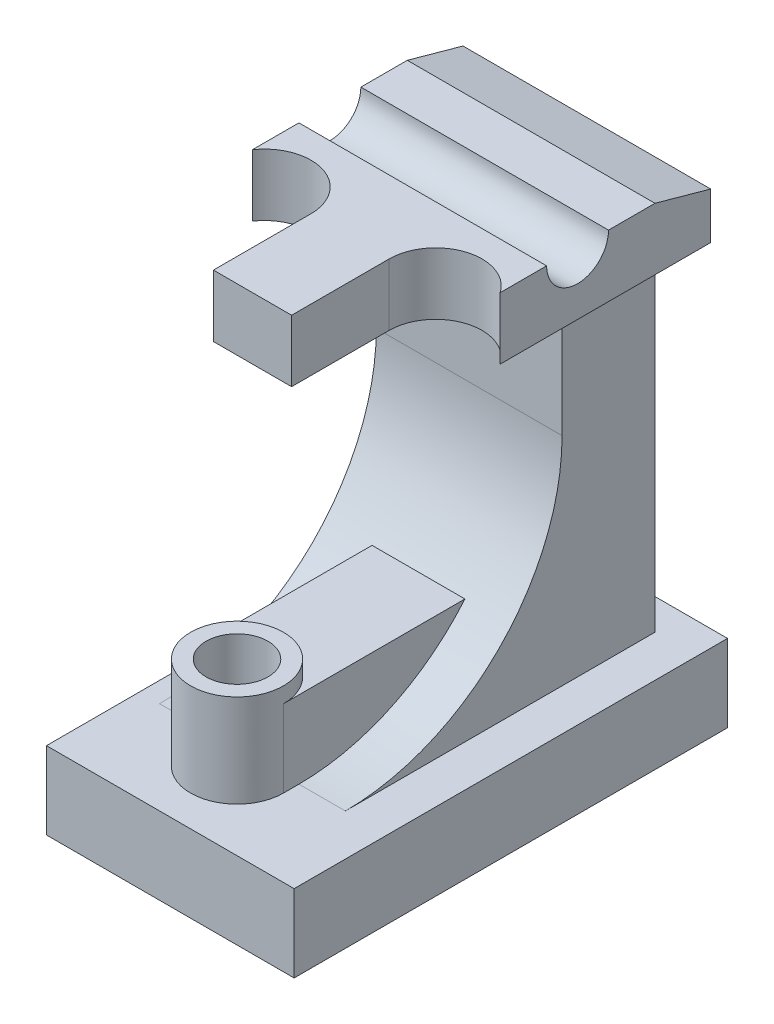
ISO-10303-21;
HEADER;
FILE_DESCRIPTION(('STEP AP214'),'2;1');
FILE_NAME('part.step','',(''),(''),'','','');
FILE_SCHEMA(('AUTOMOTIVE_DESIGN { 1 0 10303 214 1 1 1 1 }'));
ENDSEC;
DATA;
#1=APPLICATION_CONTEXT('core data for automotive mechanical design processes');
#2=APPLICATION_PROTOCOL_DEFINITION('international standard','automotive_design',2000,#1);
#3=PRODUCT_CONTEXT('',#1,'mechanical');
#4=PRODUCT('Part','Part','',(#3));
#5=PRODUCT_RELATED_PRODUCT_CATEGORY('part','',(#4));
#6=PRODUCT_DEFINITION_FORMATION('','',#4);
#7=PRODUCT_DEFINITION_CONTEXT('part definition',#1,'design');
#8=PRODUCT_DEFINITION('design','',#6,#7);
#9=PRODUCT_DEFINITION_SHAPE('','',#8);
#10=(LENGTH_UNIT() NAMED_UNIT(*) SI_UNIT(.MILLI.,.METRE.));
#11=(NAMED_UNIT(*) PLANE_ANGLE_UNIT() SI_UNIT($,.RADIAN.));
#12=(NAMED_UNIT(*) SI_UNIT($,.STERADIAN.) SOLID_ANGLE_UNIT());
#13=UNCERTAINTY_MEASURE_WITH_UNIT(LENGTH_MEASURE(1.E-05),#10,'distance_accuracy_value','');
#14=(GEOMETRIC_REPRESENTATION_CONTEXT(3) GLOBAL_UNCERTAINTY_ASSIGNED_CONTEXT((#13)) GLOBAL_UNIT_ASSIGNED_CONTEXT((#10,
#11,#12)) REPRESENTATION_CONTEXT('',''));
#15=CARTESIAN_POINT('',(0.,0.,0.));
#16=DIRECTION('',(0.,0.,1.));
#17=DIRECTION('',(1.,0.,0.));
#18=AXIS2_PLACEMENT_3D('',#15,#16,#17);
#19=CARTESIAN_POINT('',(-27.6290199979204,155.,36.5126923429088));
#20=DIRECTION('',(0.,-1.,0.));
#21=DIRECTION('',(0.,0.,-1.));
#22=AXIS2_PLACEMENT_3D('',#19,#20,#21);
#23=PLANE('',#22);
#24=DIRECTION('',(0.,0.,-1.));
#25=VECTOR('',#24,1.);
#26=CARTESIAN_POINT('',(40.,155.,28.0298358789489));
#27=LINE('',#26,#25);
#28=CARTESIAN_POINT('',(40.,155.,-6.97016412105114));
#29=VERTEX_POINT('',#28);
#30=CARTESIAN_POINT('',(40.,155.,-21.9701641210511));
#31=VERTEX_POINT('',#30);
#32=EDGE_CURVE('E368',#29,#31,#27,.T.);
#33=ORIENTED_EDGE('',*,*,#32,.T.);
#34=DIRECTION('',(1.,0.,0.));
#35=VECTOR('',#34,1.);
#36=CARTESIAN_POINT('',(-40.001,155.,-21.9701641210512));
#37=LINE('',#36,#35);
#38=CARTESIAN_POINT('',(-40.,155.,-21.9701641210512));
#39=VERTEX_POINT('',#38);
#40=EDGE_CURVE('E215',#39,#31,#37,.T.);
#41=ORIENTED_EDGE('',*,*,#40,.F.);
#42=DIRECTION('',(0.,0.,1.));
#43=VECTOR('',#42,1.);
#44=CARTESIAN_POINT('',(-40.,155.,28.0298358789489));
#45=LINE('',#44,#43);
#46=CARTESIAN_POINT('',(-40.,155.,-6.97016412105115));
#47=VERTEX_POINT('',#46);
#48=EDGE_CURVE('E223',#39,#47,#45,.T.);
#49=ORIENTED_EDGE('',*,*,#48,.T.);
#50=DIRECTION('',(1.,0.,0.));
#51=VECTOR('',#50,1.);
#52=CARTESIAN_POINT('',(-40.001,155.,-6.97016412105115));
#53=LINE('',#52,#51);
#54=EDGE_CURVE('E437',#47,#29,#53,.T.);
#55=ORIENTED_EDGE('',*,*,#54,.T.);
#56=EDGE_LOOP('',(#33,#41,#49,#55));
#57=FACE_BOUND('',#56,.T.);
#58=ADVANCED_FACE('F43',(#57),#23,.F.);
#59=CARTESIAN_POINT('',(0.,25.,0.));
#60=DIRECTION('',(0.,1.,0.));
#61=DIRECTION('',(0.,0.,1.));
#62=AXIS2_PLACEMENT_3D('',#59,#60,#61);
#63=PLANE('',#62);
#64=DIRECTION('',(0.,0.,1.));
#65=VECTOR('',#64,1.);
#66=CARTESIAN_POINT('',(-36.5539322644911,25.,-41.9701641210511));
#67=LINE('',#66,#65);
#68=CARTESIAN_POINT('',(-36.5539322644911,25.,-41.9701641210511));
#69=VERTEX_POINT('',#68);
#70=CARTESIAN_POINT('',(-36.5539322644911,25.,98.0298358789489));
#71=VERTEX_POINT('',#70);
#72=EDGE_CURVE('E741',#69,#71,#67,.T.);
#73=ORIENTED_EDGE('',*,*,#72,.T.);
#74=DIRECTION('',(1.,0.,0.));
#75=VECTOR('',#74,1.);
#76=CARTESIAN_POINT('',(-36.5539322644911,25.,98.0298358789489));
#77=LINE('',#76,#75);
#78=CARTESIAN_POINT('',(43.4460677355089,25.,98.0298358789489));
#79=VERTEX_POINT('',#78);
#80=EDGE_CURVE('E744',#71,#79,#77,.T.);
#81=ORIENTED_EDGE('',*,*,#80,.T.);
#82=DIRECTION('',(0.,0.,-1.));
#83=VECTOR('',#82,1.);
#84=CARTESIAN_POINT('',(43.4460677355089,25.,-41.9701641210511));
#85=LINE('',#84,#83);
#86=CARTESIAN_POINT('',(43.4460677355089,25.,-41.9701641210511));
#87=VERTEX_POINT('',#86);
#88=EDGE_CURVE('E747',#79,#87,#85,.T.);
#89=ORIENTED_EDGE('',*,*,#88,.T.);
#90=DIRECTION('',(-1.,0.,0.));
#91=VECTOR('',#90,1.);
#92=CARTESIAN_POINT('',(-36.5539322644911,25.,-41.9701641210511));
#93=LINE('',#92,#91);
#94=EDGE_CURVE('E749',#87,#69,#93,.T.);
#95=ORIENTED_EDGE('',*,*,#94,.T.);
#96=EDGE_LOOP('',(#73,#81,#89,#95));
#97=FACE_BOUND('',#96,.T.);
#98=DIRECTION('',(1.,0.,0.));
#99=VECTOR('',#98,1.);
#100=CARTESIAN_POINT('',(-30.,25.,68.0298358789489));
#101=LINE('',#100,#99);
#102=CARTESIAN_POINT('',(15.,25.,68.0298358789489));
#103=VERTEX_POINT('',#102);
#104=CARTESIAN_POINT('',(30.,25.,68.0298358789489));
#105=VERTEX_POINT('',#104);
#106=EDGE_CURVE('E723',#103,#105,#101,.T.);
#107=ORIENTED_EDGE('',*,*,#106,.F.);
#108=DIRECTION('',(0.,0.,1.));
#109=VECTOR('',#108,1.);
#110=CARTESIAN_POINT('',(15.,25.,0.));
#111=LINE('',#110,#109);
#112=CARTESIAN_POINT('',(15.,25.,73.0298358789489));
#113=VERTEX_POINT('',#112);
#114=EDGE_CURVE('E257',#103,#113,#111,.T.);
#115=ORIENTED_EDGE('',*,*,#114,.T.);
#116=CARTESIAN_POINT('',(0.,25.,73.0298358789489));
#117=DIRECTION('',(0.,1.,0.));
#118=DIRECTION('',(0.,0.,1.));
#119=AXIS2_PLACEMENT_3D('',#116,#117,#118);
#120=CIRCLE('',#119,15.);
#121=CARTESIAN_POINT('',(-15.,25.,73.0298358789489));
#122=VERTEX_POINT('',#121);
#123=EDGE_CURVE('E266',#113,#122,#120,.F.);
#124=ORIENTED_EDGE('',*,*,#123,.T.);
#125=DIRECTION('',(0.,0.,1.));
#126=VECTOR('',#125,1.);
#127=CARTESIAN_POINT('',(-15.,25.,0.));
#128=LINE('',#127,#126);
#129=CARTESIAN_POINT('',(-15.,25.,68.0298358789489));
#130=VERTEX_POINT('',#129);
#131=EDGE_CURVE('E252',#130,#122,#128,.T.);
#132=ORIENTED_EDGE('',*,*,#131,.F.);
#133=CARTESIAN_POINT('',(-30.,25.,68.0298358789489));
#134=VERTEX_POINT('',#133);
#135=EDGE_CURVE('E722',#134,#130,#101,.T.);
#136=ORIENTED_EDGE('',*,*,#135,.F.);
#137=DIRECTION('',(0.,0.,-1.));
#138=VECTOR('',#137,1.);
#139=CARTESIAN_POINT('',(-30.,25.,68.0298358789489));
#140=LINE('',#139,#138);
#141=CARTESIAN_POINT('',(-30.,25.,-31.9701641210511));
#142=VERTEX_POINT('',#141);
#143=EDGE_CURVE('E796',#134,#142,#140,.T.);
#144=ORIENTED_EDGE('',*,*,#143,.T.);
#145=DIRECTION('',(1.,0.,0.));
#146=VECTOR('',#145,1.);
#147=CARTESIAN_POINT('',(-30.,25.,-31.9701641210511));
#148=LINE('',#147,#146);
#149=CARTESIAN_POINT('',(30.,25.,-31.9701641210511));
#150=VERTEX_POINT('',#149);
#151=EDGE_CURVE('E738',#142,#150,#148,.T.);
#152=ORIENTED_EDGE('',*,*,#151,.T.);
#153=DIRECTION('',(0.,0.,-1.));
#154=VECTOR('',#153,1.);
#155=CARTESIAN_POINT('',(30.,25.,68.0298358789489));
#156=LINE('',#155,#154);
#157=EDGE_CURVE('E269',#105,#150,#156,.T.);
#158=ORIENTED_EDGE('',*,*,#157,.F.);
#159=EDGE_LOOP('',(#107,#115,#124,#132,#136,#144,#152,#158));
#160=FACE_BOUND('',#159,.T.);
#161=ADVANCED_FACE('F300',(#97,#160),#63,.T.);
#162=CARTESIAN_POINT('',(-30.,95.,68.0298358789489));
#163=DIRECTION('',(1.,0.,0.));
#164=DIRECTION('',(0.,0.,-1.));
#165=AXIS2_PLACEMENT_3D('',#162,#163,#164);
#166=CYLINDRICAL_SURFACE('',#165,70.);
#167=DIRECTION('',(1.,0.,0.));
#168=VECTOR('',#167,1.);
#169=CARTESIAN_POINT('',(-30.,50.,14.4108094051308));
#170=LINE('',#169,#168);
#171=CARTESIAN_POINT('',(15.,50.,14.4108094051308));
#172=VERTEX_POINT('',#171);
#173=CARTESIAN_POINT('',(-15.,50.,14.4108094051308));
#174=VERTEX_POINT('',#173);
#175=EDGE_CURVE('E246',#172,#174,#170,.F.);
#176=ORIENTED_EDGE('',*,*,#175,.F.);
#177=CARTESIAN_POINT('',(15.,95.,68.0298358789489));
#178=DIRECTION('',(-1.,0.,0.));
#179=DIRECTION('',(0.,0.,1.));
#180=AXIS2_PLACEMENT_3D('',#177,#178,#179);
#181=CIRCLE('',#180,70.);
#182=EDGE_CURVE('E255',#172,#103,#181,.T.);
#183=ORIENTED_EDGE('',*,*,#182,.T.);
#184=ORIENTED_EDGE('',*,*,#106,.T.);
#185=CARTESIAN_POINT('',(30.,95.,68.0298358789489));
#186=DIRECTION('',(-1.,0.,0.));
#187=DIRECTION('',(0.,0.,1.));
#188=AXIS2_PLACEMENT_3D('',#185,#186,#187);
#189=CIRCLE('',#188,70.);
#190=CARTESIAN_POINT('',(30.,95.,-1.97016412105114));
#191=VERTEX_POINT('',#190);
#192=EDGE_CURVE('E794',#191,#105,#189,.T.);
#193=ORIENTED_EDGE('',*,*,#192,.F.);
#194=DIRECTION('',(1.,0.,0.));
#195=VECTOR('',#194,1.);
#196=CARTESIAN_POINT('',(-30.,95.,-1.97016412105114));
#197=LINE('',#196,#195);
#198=CARTESIAN_POINT('',(-30.,95.,-1.97016412105114));
#199=VERTEX_POINT('',#198);
#200=EDGE_CURVE('E727',#199,#191,#197,.T.);
#201=ORIENTED_EDGE('',*,*,#200,.F.);
#202=CARTESIAN_POINT('',(-30.,95.,68.0298358789489));
#203=DIRECTION('',(-1.,0.,0.));
#204=DIRECTION('',(0.,0.,1.));
#205=AXIS2_PLACEMENT_3D('',#202,#203,#204);
#206=CIRCLE('',#205,70.);
#207=EDGE_CURVE('E730',#199,#134,#206,.T.);
#208=ORIENTED_EDGE('',*,*,#207,.T.);
#209=ORIENTED_EDGE('',*,*,#135,.T.);
#210=CARTESIAN_POINT('',(-15.,95.,68.0298358789489));
#211=DIRECTION('',(-1.,0.,0.));
#212=DIRECTION('',(0.,0.,1.));
#213=AXIS2_PLACEMENT_3D('',#210,#211,#212);
#214=CIRCLE('',#213,70.);
#215=EDGE_CURVE('E249',#174,#130,#214,.T.);
#216=ORIENTED_EDGE('',*,*,#215,.F.);
#217=EDGE_LOOP('',(#176,#183,#184,#193,#201,#208,#209,#216));
#218=FACE_BOUND('',#217,.T.);
#219=ADVANCED_FACE('F297',(#218),#166,.F.);
#220=CARTESIAN_POINT('',(-36.5539322644911,25.,-41.9701641210511));
#221=DIRECTION('',(1.,0.,0.));
#222=DIRECTION('',(0.,0.,-1.));
#223=AXIS2_PLACEMENT_3D('',#220,#221,#222);
#224=PLANE('',#223);
#225=DIRECTION('',(0.,0.,1.));
#226=VECTOR('',#225,1.);
#227=CARTESIAN_POINT('',(-36.5539322644911,0.,-41.9701641210511));
#228=LINE('',#227,#226);
#229=CARTESIAN_POINT('',(-36.5539322644911,0.,-41.9701641210511));
#230=VERTEX_POINT('',#229);
#231=CARTESIAN_POINT('',(-36.5539322644911,0.,98.0298358789489));
#232=VERTEX_POINT('',#231);
#233=EDGE_CURVE('E726',#230,#232,#228,.T.);
#234=ORIENTED_EDGE('',*,*,#233,.T.);
#235=DIRECTION('',(0.,-1.,0.));
#236=VECTOR('',#235,1.);
#237=CARTESIAN_POINT('',(-36.5539322644911,25.,98.0298358789489));
#238=LINE('',#237,#236);
#239=EDGE_CURVE('E767',#71,#232,#238,.T.);
#240=ORIENTED_EDGE('',*,*,#239,.F.);
#241=ORIENTED_EDGE('',*,*,#72,.F.);
#242=DIRECTION('',(0.,-1.,0.));
#243=VECTOR('',#242,1.);
#244=CARTESIAN_POINT('',(-36.5539322644911,25.,-41.9701641210511));
#245=LINE('',#244,#243);
#246=EDGE_CURVE('E751',#69,#230,#245,.T.);
#247=ORIENTED_EDGE('',*,*,#246,.T.);
#248=EDGE_LOOP('',(#234,#240,#241,#247));
#249=FACE_BOUND('',#248,.T.);
#250=ADVANCED_FACE('F45',(#249),#224,.F.);
#251=CARTESIAN_POINT('',(-36.5539322644911,25.,98.0298358789489));
#252=DIRECTION('',(0.,0.,-1.));
#253=DIRECTION('',(-1.,0.,0.));
#254=AXIS2_PLACEMENT_3D('',#251,#252,#253);
#255=PLANE('',#254);
#256=DIRECTION('',(1.,0.,0.));
#257=VECTOR('',#256,1.);
#258=CARTESIAN_POINT('',(-36.5539322644911,0.,98.0298358789489));
#259=LINE('',#258,#257);
#260=CARTESIAN_POINT('',(43.4460677355089,0.,98.0298358789489));
#261=VERTEX_POINT('',#260);
#262=EDGE_CURVE('E754',#232,#261,#259,.T.);
#263=ORIENTED_EDGE('',*,*,#262,.T.);
#264=DIRECTION('',(0.,-1.,0.));
#265=VECTOR('',#264,1.);
#266=CARTESIAN_POINT('',(43.4460677355089,25.,98.0298358789489));
#267=LINE('',#266,#265);
#268=EDGE_CURVE('E764',#79,#261,#267,.T.);
#269=ORIENTED_EDGE('',*,*,#268,.F.);
#270=ORIENTED_EDGE('',*,*,#80,.F.);
#271=ORIENTED_EDGE('',*,*,#239,.T.);
#272=EDGE_LOOP('',(#263,#269,#270,#271));
#273=FACE_BOUND('',#272,.T.);
#274=ADVANCED_FACE('F324',(#273),#255,.F.);
#275=CARTESIAN_POINT('',(43.4460677355089,25.,-41.9701641210511));
#276=DIRECTION('',(-1.,0.,0.));
#277=DIRECTION('',(0.,0.,1.));
#278=AXIS2_PLACEMENT_3D('',#275,#276,#277);
#279=PLANE('',#278);
#280=DIRECTION('',(0.,0.,-1.));
#281=VECTOR('',#280,1.);
#282=CARTESIAN_POINT('',(43.4460677355089,0.,-41.9701641210511));
#283=LINE('',#282,#281);
#284=CARTESIAN_POINT('',(43.4460677355089,0.,-41.9701641210511));
#285=VERTEX_POINT('',#284);
#286=EDGE_CURVE('E756',#261,#285,#283,.T.);
#287=ORIENTED_EDGE('',*,*,#286,.T.);
#288=DIRECTION('',(0.,-1.,0.));
#289=VECTOR('',#288,1.);
#290=CARTESIAN_POINT('',(43.4460677355089,25.,-41.9701641210511));
#291=LINE('',#290,#289);
#292=EDGE_CURVE('E761',#87,#285,#291,.T.);
#293=ORIENTED_EDGE('',*,*,#292,.F.);
#294=ORIENTED_EDGE('',*,*,#88,.F.);
#295=ORIENTED_EDGE('',*,*,#268,.T.);
#296=EDGE_LOOP('',(#287,#293,#294,#295));
#297=FACE_BOUND('',#296,.T.);
#298=ADVANCED_FACE('F321',(#297),#279,.F.);
#299=CARTESIAN_POINT('',(-36.5539322644911,25.,-41.9701641210511));
#300=DIRECTION('',(0.,0.,1.));
#301=DIRECTION('',(1.,0.,0.));
#302=AXIS2_PLACEMENT_3D('',#299,#300,#301);
#303=PLANE('',#302);
#304=DIRECTION('',(-1.,0.,0.));
#305=VECTOR('',#304,1.);
#306=CARTESIAN_POINT('',(-36.5539322644911,0.,-41.9701641210511));
#307=LINE('',#306,#305);
#308=EDGE_CURVE('E745',#285,#230,#307,.T.);
#309=ORIENTED_EDGE('',*,*,#308,.T.);
#310=ORIENTED_EDGE('',*,*,#246,.F.);
#311=ORIENTED_EDGE('',*,*,#94,.F.);
#312=ORIENTED_EDGE('',*,*,#292,.T.);
#313=EDGE_LOOP('',(#309,#310,#311,#312));
#314=FACE_BOUND('',#313,.T.);
#315=ADVANCED_FACE('F317',(#314),#303,.F.);
#316=CARTESIAN_POINT('',(0.,0.,0.));
#317=DIRECTION('',(0.,1.,0.));
#318=DIRECTION('',(0.,0.,1.));
#319=AXIS2_PLACEMENT_3D('',#316,#317,#318);
#320=PLANE('',#319);
#321=ORIENTED_EDGE('',*,*,#233,.F.);
#322=ORIENTED_EDGE('',*,*,#308,.F.);
#323=ORIENTED_EDGE('',*,*,#286,.F.);
#324=ORIENTED_EDGE('',*,*,#262,.F.);
#325=EDGE_LOOP('',(#321,#322,#323,#324));
#326=FACE_BOUND('',#325,.T.);
#327=ADVANCED_FACE('F306',(#326),#320,.F.);
#328=CARTESIAN_POINT('',(-30.,135.,-1.97016412105114));
#329=DIRECTION('',(0.,0.,1.));
#330=DIRECTION('',(0.,-1.,0.));
#331=AXIS2_PLACEMENT_3D('',#328,#329,#330);
#332=PLANE('',#331);
#333=ORIENTED_EDGE('',*,*,#200,.T.);
#334=DIRECTION('',(0.,-1.,0.));
#335=VECTOR('',#334,1.);
#336=CARTESIAN_POINT('',(30.,135.,-1.97016412105114));
#337=LINE('',#336,#335);
#338=CARTESIAN_POINT('',(30.,135.,-1.97016412105114));
#339=VERTEX_POINT('',#338);
#340=EDGE_CURVE('E789',#339,#191,#337,.T.);
#341=ORIENTED_EDGE('',*,*,#340,.F.);
#342=DIRECTION('',(1.,0.,0.));
#343=VECTOR('',#342,1.);
#344=CARTESIAN_POINT('',(-30.,135.,-1.97016412105114));
#345=LINE('',#344,#343);
#346=CARTESIAN_POINT('',(-30.,135.,-1.97016412105114));
#347=VERTEX_POINT('',#346);
#348=EDGE_CURVE('E733',#347,#339,#345,.T.);
#349=ORIENTED_EDGE('',*,*,#348,.F.);
#350=DIRECTION('',(0.,-1.,0.));
#351=VECTOR('',#350,1.);
#352=CARTESIAN_POINT('',(-30.,135.,-1.97016412105114));
#353=LINE('',#352,#351);
#354=EDGE_CURVE('E803',#347,#199,#353,.T.);
#355=ORIENTED_EDGE('',*,*,#354,.T.);
#356=EDGE_LOOP('',(#333,#341,#349,#355));
#357=FACE_BOUND('',#356,.T.);
#358=ADVANCED_FACE('F303',(#357),#332,.T.);
#359=CARTESIAN_POINT('',(-30.,25.,-31.9701641210511));
#360=DIRECTION('',(0.,0.,-1.));
#361=DIRECTION('',(0.,1.,0.));
#362=AXIS2_PLACEMENT_3D('',#359,#360,#361);
#363=PLANE('',#362);
#364=DIRECTION('',(1.,0.,0.));
#365=VECTOR('',#364,1.);
#366=CARTESIAN_POINT('',(-30.,135.,-31.9701641210511));
#367=LINE('',#366,#365);
#368=CARTESIAN_POINT('',(-30.,135.,-31.9701641210511));
#369=VERTEX_POINT('',#368);
#370=CARTESIAN_POINT('',(30.,135.,-31.9701641210511));
#371=VERTEX_POINT('',#370);
#372=EDGE_CURVE('E736',#369,#371,#367,.T.);
#373=ORIENTED_EDGE('',*,*,#372,.T.);
#374=DIRECTION('',(0.,1.,0.));
#375=VECTOR('',#374,1.);
#376=CARTESIAN_POINT('',(30.,25.,-31.9701641210511));
#377=LINE('',#376,#375);
#378=EDGE_CURVE('E786',#150,#371,#377,.T.);
#379=ORIENTED_EDGE('',*,*,#378,.F.);
#380=ORIENTED_EDGE('',*,*,#151,.F.);
#381=DIRECTION('',(0.,1.,0.));
#382=VECTOR('',#381,1.);
#383=CARTESIAN_POINT('',(-30.,25.,-31.9701641210511));
#384=LINE('',#383,#382);
#385=EDGE_CURVE('E798',#142,#369,#384,.T.);
#386=ORIENTED_EDGE('',*,*,#385,.T.);
#387=EDGE_LOOP('',(#373,#379,#380,#386));
#388=FACE_BOUND('',#387,.T.);
#389=ADVANCED_FACE('F295',(#388),#363,.T.);
#390=CARTESIAN_POINT('',(-30.,95.,68.0298358789489));
#391=DIRECTION('',(-1.,0.,0.));
#392=DIRECTION('',(0.,0.,1.));
#393=AXIS2_PLACEMENT_3D('',#390,#391,#392);
#394=PLANE('',#393);
#395=ORIENTED_EDGE('',*,*,#143,.F.);
#396=ORIENTED_EDGE('',*,*,#207,.F.);
#397=ORIENTED_EDGE('',*,*,#354,.F.);
#398=DIRECTION('',(0.,0.,1.));
#399=VECTOR('',#398,1.);
#400=CARTESIAN_POINT('',(-30.,135.,-31.9701641210511));
#401=LINE('',#400,#399);
#402=EDGE_CURVE('E801',#369,#347,#401,.T.);
#403=ORIENTED_EDGE('',*,*,#402,.F.);
#404=ORIENTED_EDGE('',*,*,#385,.F.);
#405=EDGE_LOOP('',(#395,#396,#397,#403,#404));
#406=FACE_BOUND('',#405,.T.);
#407=ADVANCED_FACE('F291',(#406),#394,.T.);
#408=CARTESIAN_POINT('',(30.,95.,68.0298358789489));
#409=DIRECTION('',(-1.,0.,0.));
#410=DIRECTION('',(0.,0.,1.));
#411=AXIS2_PLACEMENT_3D('',#408,#409,#410);
#412=PLANE('',#411);
#413=ORIENTED_EDGE('',*,*,#157,.T.);
#414=ORIENTED_EDGE('',*,*,#378,.T.);
#415=DIRECTION('',(0.,0.,1.));
#416=VECTOR('',#415,1.);
#417=CARTESIAN_POINT('',(30.,135.,-31.9701641210511));
#418=LINE('',#417,#416);
#419=EDGE_CURVE('E787',#371,#339,#418,.T.);
#420=ORIENTED_EDGE('',*,*,#419,.T.);
#421=ORIENTED_EDGE('',*,*,#340,.T.);
#422=ORIENTED_EDGE('',*,*,#192,.T.);
#423=EDGE_LOOP('',(#413,#414,#420,#421,#422));
#424=FACE_BOUND('',#423,.T.);
#425=ADVANCED_FACE('F287',(#424),#412,.F.);
#426=CARTESIAN_POINT('',(0.,55.,73.0298358789489));
#427=DIRECTION('',(0.,1.,0.));
#428=DIRECTION('',(0.,0.,1.));
#429=AXIS2_PLACEMENT_3D('',#426,#427,#428);
#430=PLANE('',#429);
#431=CARTESIAN_POINT('',(0.,55.,73.0298358789489));
#432=DIRECTION('',(0.,1.,0.));
#433=DIRECTION('',(0.,0.,1.));
#434=AXIS2_PLACEMENT_3D('',#431,#432,#433);
#435=CIRCLE('',#434,10.);
#436=CARTESIAN_POINT('',(0.,55.,83.0298358789489));
#437=VERTEX_POINT('',#436);
#438=EDGE_CURVE('E260',#437,#437,#435,.T.);
#439=ORIENTED_EDGE('',*,*,#438,.F.);
#440=EDGE_LOOP('',(#439));
#441=FACE_BOUND('',#440,.T.);
#442=CARTESIAN_POINT('',(0.,55.,73.0298358789489));
#443=DIRECTION('',(0.,1.,0.));
#444=DIRECTION('',(0.,0.,1.));
#445=AXIS2_PLACEMENT_3D('',#442,#443,#444);
#446=CIRCLE('',#445,15.);
#447=CARTESIAN_POINT('',(0.,55.,88.0298358789489));
#448=VERTEX_POINT('',#447);
#449=EDGE_CURVE('E259',#448,#448,#446,.T.);
#450=ORIENTED_EDGE('',*,*,#449,.T.);
#451=EDGE_LOOP('',(#450));
#452=FACE_BOUND('',#451,.T.);
#453=ADVANCED_FACE('F290',(#441,#452),#430,.T.);
#454=CARTESIAN_POINT('',(0.,-0.002000000000002,73.0298358789489));
#455=DIRECTION('',(0.,1.,0.));
#456=DIRECTION('',(0.,0.,1.));
#457=AXIS2_PLACEMENT_3D('',#454,#455,#456);
#458=CYLINDRICAL_SURFACE('',#457,15.);
#459=DIRECTION('',(0.,1.,0.));
#460=VECTOR('',#459,1.);
#461=CARTESIAN_POINT('',(15.,-0.002000000000002,73.0298358789489));
#462=LINE('',#461,#460);
#463=CARTESIAN_POINT('',(15.,50.,73.0298358789489));
#464=VERTEX_POINT('',#463);
#465=EDGE_CURVE('E12',#464,#113,#462,.F.);
#466=ORIENTED_EDGE('',*,*,#465,.F.);
#467=CARTESIAN_POINT('',(0.,50.,73.0298358789489));
#468=DIRECTION('',(0.,1.,0.));
#469=DIRECTION('',(0.,0.,1.));
#470=AXIS2_PLACEMENT_3D('',#467,#468,#469);
#471=CIRCLE('',#470,15.);
#472=CARTESIAN_POINT('',(-15.,50.,73.0298358789489));
#473=VERTEX_POINT('',#472);
#474=EDGE_CURVE('E241',#464,#473,#471,.T.);
#475=ORIENTED_EDGE('',*,*,#474,.T.);
#476=DIRECTION('',(0.,1.,0.));
#477=VECTOR('',#476,1.);
#478=CARTESIAN_POINT('',(-15.,-0.002000000000002,73.0298358789489));
#479=LINE('',#478,#477);
#480=EDGE_CURVE('E51',#473,#122,#479,.F.);
#481=ORIENTED_EDGE('',*,*,#480,.T.);
#482=ORIENTED_EDGE('',*,*,#123,.F.);
#483=EDGE_LOOP('',(#466,#475,#481,#482));
#484=FACE_BOUND('',#483,.T.);
#485=ORIENTED_EDGE('',*,*,#449,.F.);
#486=EDGE_LOOP('',(#485));
#487=FACE_BOUND('',#486,.T.);
#488=ADVANCED_FACE('F286',(#484,#487),#458,.T.);
#489=CARTESIAN_POINT('',(0.,-0.002000000000002,73.0298358789489));
#490=DIRECTION('',(0.,1.,0.));
#491=DIRECTION('',(0.,0.,1.));
#492=AXIS2_PLACEMENT_3D('',#489,#490,#491);
#493=CYLINDRICAL_SURFACE('',#492,10.);
#494=CARTESIAN_POINT('',(0.,25.,73.0298358789489));
#495=DIRECTION('',(0.,1.,0.));
#496=DIRECTION('',(0.,0.,1.));
#497=AXIS2_PLACEMENT_3D('',#494,#495,#496);
#498=CIRCLE('',#497,10.);
#499=CARTESIAN_POINT('',(8.66025403784438,25.,68.0298358789489));
#500=VERTEX_POINT('',#499);
#501=CARTESIAN_POINT('',(-8.66025403784438,25.,68.0298358789489));
#502=VERTEX_POINT('',#501);
#503=EDGE_CURVE('E263',#500,#502,#498,.F.);
#504=ORIENTED_EDGE('',*,*,#503,.T.);
#505=CARTESIAN_POINT('',(-8.66025403784439,25.,68.0298358789489));
#506=CARTESIAN_POINT('',(-8.51979912234648,24.9999927406852,67.7864993331164));
#507=CARTESIAN_POINT('',(-8.36904160511733,25.001268822178,67.549120591718));
#508=CARTESIAN_POINT('',(-8.04812321644508,25.0059595923181,67.0879113991152));
#509=CARTESIAN_POINT('',(-7.87796386799146,25.0093741131983,66.8640798865999));
#510=CARTESIAN_POINT('',(-7.51956318712389,25.0179104403205,66.4317303644865));
#511=CARTESIAN_POINT('',(-7.33133627693649,25.0230308927584,66.2232003714297));
#512=CARTESIAN_POINT('',(-6.93803404080332,25.0345172034624,65.8227256082939));
#513=CARTESIAN_POINT('',(-6.73295877843701,25.0408830570288,65.6307807756343));
#514=CARTESIAN_POINT('',(-6.30733394698988,25.0543929833325,65.2647633895788));
#515=CARTESIAN_POINT('',(-6.08677896545906,25.0615373287551,65.0906971403229));
#516=CARTESIAN_POINT('',(-5.63181600416843,25.076136762703,64.7617375940159));
#517=CARTESIAN_POINT('',(-5.39740801023278,25.0835918515463,64.6068443165851));
#518=CARTESIAN_POINT('',(-4.91642895303607,25.098366083971,64.3173447490435));
#519=CARTESIAN_POINT('',(-4.66985982054768,25.1056852488801,64.1827352522361));
#520=CARTESIAN_POINT('',(-4.16626216368057,25.119777446192,63.9347251514322));
#521=CARTESIAN_POINT('',(-3.90923367206777,25.1265504803053,63.8213244810013));
#522=CARTESIAN_POINT('',(-3.38604118705451,25.1391978898092,63.6163451019798));
#523=CARTESIAN_POINT('',(-3.11986103254183,25.1450705636762,63.5248075331331));
#524=CARTESIAN_POINT('',(-2.5807102337739,25.1555947131484,63.3644837580745));
#525=CARTESIAN_POINT('',(-2.30773957004575,25.1602461852512,63.295697617114));
#526=CARTESIAN_POINT('',(-1.7569149030012,25.1680902587126,63.1813649168804));
#527=CARTESIAN_POINT('',(-1.47906025329772,25.1712826654336,63.1358214580596));
#528=CARTESIAN_POINT('',(-0.920487394130041,25.1760464720664,63.0683177940673));
#529=CARTESIAN_POINT('',(-0.639769192269917,25.1776178762815,63.0463575262877));
#530=CARTESIAN_POINT('',(-0.0780688843010455,25.1790594672232,63.0262006619765));
#531=CARTESIAN_POINT('',(0.202911421718633,25.1789332288715,63.0279541287425));
#532=CARTESIAN_POINT('',(0.763722638659976,25.1769945104264,63.0550908219759));
#533=CARTESIAN_POINT('',(1.04355355044186,25.1751820315953,63.0804740307554));
#534=CARTESIAN_POINT('',(1.60003618771616,25.1699616760829,63.1546817608535));
#535=CARTESIAN_POINT('',(1.87668833324887,25.1665540127313,63.2035031477264));
#536=CARTESIAN_POINT('',(2.42488550317682,25.1583149651442,63.3242341814012));
#537=CARTESIAN_POINT('',(2.69643053712341,25.1534835835716,63.3961437850188));
#538=CARTESIAN_POINT('',(3.23228823639555,25.1426481740391,63.5624731918365));
#539=CARTESIAN_POINT('',(3.4966061802232,25.1366450294865,63.6568760488392));
#540=CARTESIAN_POINT('',(4.01636301256334,25.1237771876561,63.8675510678812));
#541=CARTESIAN_POINT('',(4.27180169264502,25.1169124701711,63.9838237428799));
#542=CARTESIAN_POINT('',(4.77211347992271,25.1026887322122,64.2374736953353));
#543=CARTESIAN_POINT('',(5.01698154779416,25.0953294801613,64.374860899453));
#544=CARTESIAN_POINT('',(5.49429283399996,25.0805360322526,64.6697260549316));
#545=CARTESIAN_POINT('',(5.72673646836881,25.0731018389141,64.8272033329737));
#546=CARTESIAN_POINT('',(6.17829803174153,25.0585830904553,65.1616826826239));
#547=CARTESIAN_POINT('',(6.39737063885389,25.0514997383325,65.3387459950908));
#548=CARTESIAN_POINT('',(6.81981295045667,25.0381793008792,65.7107272975341));
#549=CARTESIAN_POINT('',(7.02318316402056,25.0319421881085,65.9056447082302));
#550=CARTESIAN_POINT('',(7.41245129751744,25.0207968678443,66.3116118751762));
#551=CARTESIAN_POINT('',(7.59837745902336,25.0158864872881,66.5226345163758));
#552=CARTESIAN_POINT('',(7.95173587319316,25.0078426748688,66.9595185904606));
#553=CARTESIAN_POINT('',(8.11917869628064,25.0047082230874,67.1853714230054));
#554=CARTESIAN_POINT('',(8.34440123310929,25.0018035475525,67.5175313243717));
#555=CARTESIAN_POINT('',(8.41020764936744,25.0011343033378,67.6184656307711));
#556=CARTESIAN_POINT('',(8.53804856582853,25.0002327721068,67.8225145266147));
#557=CARTESIAN_POINT('',(8.60008785837241,24.9999999181694,67.9256261110692));
#558=CARTESIAN_POINT('',(8.66025403784439,25.,68.0298358789489));
#559=B_SPLINE_CURVE_WITH_KNOTS('',3,(#505,#506,#507,#508,#509,#510,#511,#512,#513,#514,#515,
#516,#517,#518,#519,#520,#521,#522,#523,#524,#525,#526,#527,#528,#529,#530,#531,#532,#533,#534,
#535,#536,#537,#538,#539,#540,#541,#542,#543,#544,#545,#546,#547,#548,#549,#550,#551,#552,#553,
#554,#555,#556,#557,#558),.UNSPECIFIED.,.F.,.F.,(4,2,2,2,2,2,2,2,2,2,2,2,2,2,2,2,2,2,2,2,2,2,2,
2,2,2,4),(0.,0.842623790253687,1.685181482374,2.52707211854574,3.36895957787842,
4.21114288204973,5.05332704804535,5.89537793174387,6.73742617776196,7.58104663618028,
8.42466951409576,9.26840489749779,10.1121380409689,10.9540947169556,11.7960507627006,
12.6378942429233,13.4797361485686,14.3209458130659,15.1621752107063,16.0038013157166,
16.8453992210396,17.6897072448841,18.533987884658,19.3768771716953,20.2192818943213,
20.5806972017598,20.9416426629853),.UNSPECIFIED.);
#560=EDGE_CURVE('E270',#502,#500,#559,.T.);
#561=ORIENTED_EDGE('',*,*,#560,.T.);
#562=EDGE_LOOP('',(#504,#561));
#563=FACE_BOUND('',#562,.T.);
#564=ORIENTED_EDGE('',*,*,#438,.T.);
#565=EDGE_LOOP('',(#564));
#566=FACE_BOUND('',#565,.T.);
#567=ADVANCED_FACE('F280',(#563,#566),#493,.F.);
#568=EDGE_CURVE('E721',#502,#500,#101,.T.);
#569=ORIENTED_EDGE('',*,*,#568,.T.);
#570=ORIENTED_EDGE('',*,*,#560,.F.);
#571=EDGE_LOOP('',(#569,#570));
#572=FACE_BOUND('',#571,.T.);
#573=ADVANCED_FACE('F302',(#572),#166,.F.);
#574=ORIENTED_EDGE('',*,*,#568,.F.);
#575=ORIENTED_EDGE('',*,*,#503,.F.);
#576=EDGE_LOOP('',(#574,#575));
#577=FACE_BOUND('',#576,.T.);
#578=ADVANCED_FACE('F314',(#577),#63,.T.);
#579=CARTESIAN_POINT('',(15.,20.,0.));
#580=DIRECTION('',(-1.,0.,0.));
#581=DIRECTION('',(0.,0.,1.));
#582=AXIS2_PLACEMENT_3D('',#579,#580,#581);
#583=PLANE('',#582);
#584=ORIENTED_EDGE('',*,*,#114,.F.);
#585=ORIENTED_EDGE('',*,*,#182,.F.);
#586=DIRECTION('',(0.,0.,1.));
#587=VECTOR('',#586,1.);
#588=CARTESIAN_POINT('',(15.,50.,0.));
#589=LINE('',#588,#587);
#590=EDGE_CURVE('E243',#172,#464,#589,.T.);
#591=ORIENTED_EDGE('',*,*,#590,.T.);
#592=ORIENTED_EDGE('',*,*,#465,.T.);
#593=EDGE_LOOP('',(#584,#585,#591,#592));
#594=FACE_BOUND('',#593,.T.);
#595=ADVANCED_FACE('F577',(#594),#583,.F.);
#596=CARTESIAN_POINT('',(-15.,20.,0.));
#597=DIRECTION('',(-1.,0.,0.));
#598=DIRECTION('',(0.,0.,1.));
#599=AXIS2_PLACEMENT_3D('',#596,#597,#598);
#600=PLANE('',#599);
#601=ORIENTED_EDGE('',*,*,#215,.T.);
#602=ORIENTED_EDGE('',*,*,#131,.T.);
#603=ORIENTED_EDGE('',*,*,#480,.F.);
#604=DIRECTION('',(0.,0.,1.));
#605=VECTOR('',#604,1.);
#606=CARTESIAN_POINT('',(-15.,50.,0.));
#607=LINE('',#606,#605);
#608=EDGE_CURVE('E232',#174,#473,#607,.T.);
#609=ORIENTED_EDGE('',*,*,#608,.F.);
#610=EDGE_LOOP('',(#601,#602,#603,#609));
#611=FACE_BOUND('',#610,.T.);
#612=ADVANCED_FACE('F566',(#611),#600,.T.);
#613=CARTESIAN_POINT('',(0.,50.,0.));
#614=DIRECTION('',(0.,1.,0.));
#615=DIRECTION('',(0.,0.,1.));
#616=AXIS2_PLACEMENT_3D('',#613,#614,#615);
#617=PLANE('',#616);
#618=ORIENTED_EDGE('',*,*,#590,.F.);
#619=ORIENTED_EDGE('',*,*,#175,.T.);
#620=ORIENTED_EDGE('',*,*,#608,.T.);
#621=ORIENTED_EDGE('',*,*,#474,.F.);
#622=EDGE_LOOP('',(#618,#619,#620,#621));
#623=FACE_BOUND('',#622,.T.);
#624=ADVANCED_FACE('F490',(#623),#617,.T.);
#625=CARTESIAN_POINT('',(40.,155.,28.0298358789489));
#626=DIRECTION('',(-1.,0.,0.));
#627=DIRECTION('',(0.,0.,1.));
#628=AXIS2_PLACEMENT_3D('',#625,#626,#627);
#629=PLANE('',#628);
#630=DIRECTION('',(0.,-1.,0.));
#631=VECTOR('',#630,1.);
#632=CARTESIAN_POINT('',(40.,155.,-39.9701641210511));
#633=LINE('',#632,#631);
#634=CARTESIAN_POINT('',(40.,150.,-39.9701641210511));
#635=VERTEX_POINT('',#634);
#636=CARTESIAN_POINT('',(40.,135.,-39.9701641210511));
#637=VERTEX_POINT('',#636);
#638=EDGE_CURVE('E229',#635,#637,#633,.T.);
#639=ORIENTED_EDGE('',*,*,#638,.F.);
#640=DIRECTION('',(0.,-0.267643863786095,-0.963517909629941));
#641=VECTOR('',#640,1.);
#642=CARTESIAN_POINT('',(40.,155.,-21.9701641210511));
#643=LINE('',#642,#641);
#644=EDGE_CURVE('E211',#31,#635,#643,.T.);
#645=ORIENTED_EDGE('',*,*,#644,.F.);
#646=ORIENTED_EDGE('',*,*,#32,.F.);
#647=CARTESIAN_POINT('',(40.,155.,3.02983587894885));
#648=DIRECTION('',(1.,0.,0.));
#649=DIRECTION('',(0.,0.,-1.));
#650=AXIS2_PLACEMENT_3D('',#647,#648,#649);
#651=CIRCLE('',#650,10.);
#652=CARTESIAN_POINT('',(40.,155.,13.0298358789489));
#653=VERTEX_POINT('',#652);
#654=EDGE_CURVE('E438',#653,#29,#651,.T.);
#655=ORIENTED_EDGE('',*,*,#654,.F.);
#656=CARTESIAN_POINT('',(40.,155.,28.0298358789489));
#657=VERTEX_POINT('',#656);
#658=EDGE_CURVE('E358',#657,#653,#27,.T.);
#659=ORIENTED_EDGE('',*,*,#658,.F.);
#660=DIRECTION('',(0.,-1.,0.));
#661=VECTOR('',#660,1.);
#662=CARTESIAN_POINT('',(40.,155.,28.0298358789489));
#663=LINE('',#662,#661);
#664=CARTESIAN_POINT('',(40.,135.,28.0298358789489));
#665=VERTEX_POINT('',#664);
#666=EDGE_CURVE('E384',#657,#665,#663,.T.);
#667=ORIENTED_EDGE('',*,*,#666,.T.);
#668=DIRECTION('',(0.,0.,-1.));
#669=VECTOR('',#668,1.);
#670=CARTESIAN_POINT('',(40.,135.,28.0298358789489));
#671=LINE('',#670,#669);
#672=EDGE_CURVE('E385',#665,#637,#671,.T.);
#673=ORIENTED_EDGE('',*,*,#672,.T.);
#674=EDGE_LOOP('',(#639,#645,#646,#655,#659,#667,#673));
#675=FACE_BOUND('',#674,.T.);
#676=ADVANCED_FACE('F433',(#675),#629,.F.);
#677=CARTESIAN_POINT('',(-40.,155.,-39.9701641210511));
#678=DIRECTION('',(0.,0.,1.));
#679=DIRECTION('',(1.,0.,0.));
#680=AXIS2_PLACEMENT_3D('',#677,#678,#679);
#681=PLANE('',#680);
#682=DIRECTION('',(0.,-1.,0.));
#683=VECTOR('',#682,1.);
#684=CARTESIAN_POINT('',(-40.,155.,-39.9701641210511));
#685=LINE('',#684,#683);
#686=CARTESIAN_POINT('',(-40.,150.,-39.9701641210511));
#687=VERTEX_POINT('',#686);
#688=CARTESIAN_POINT('',(-40.,135.,-39.9701641210511));
#689=VERTEX_POINT('',#688);
#690=EDGE_CURVE('E220',#687,#689,#685,.T.);
#691=ORIENTED_EDGE('',*,*,#690,.F.);
#692=DIRECTION('',(1.,0.,0.));
#693=VECTOR('',#692,1.);
#694=CARTESIAN_POINT('',(-40.001,150.,-39.9701641210511));
#695=LINE('',#694,#693);
#696=EDGE_CURVE('E208',#687,#635,#695,.T.);
#697=ORIENTED_EDGE('',*,*,#696,.T.);
#698=ORIENTED_EDGE('',*,*,#638,.T.);
#699=DIRECTION('',(-1.,0.,0.));
#700=VECTOR('',#699,1.);
#701=CARTESIAN_POINT('',(-40.,135.,-39.9701641210511));
#702=LINE('',#701,#700);
#703=EDGE_CURVE('E227',#637,#689,#702,.T.);
#704=ORIENTED_EDGE('',*,*,#703,.T.);
#705=EDGE_LOOP('',(#691,#697,#698,#704));
#706=FACE_BOUND('',#705,.T.);
#707=ADVANCED_FACE('F225',(#706),#681,.F.);
#708=CARTESIAN_POINT('',(-40.,155.,28.0298358789489));
#709=DIRECTION('',(1.,0.,0.));
#710=DIRECTION('',(0.,0.,-1.));
#711=AXIS2_PLACEMENT_3D('',#708,#709,#710);
#712=PLANE('',#711);
#713=ORIENTED_EDGE('',*,*,#48,.F.);
#714=DIRECTION('',(0.,0.267643863786095,0.963517909629941));
#715=VECTOR('',#714,1.);
#716=CARTESIAN_POINT('',(-40.,155.,-21.9701641210512));
#717=LINE('',#716,#715);
#718=EDGE_CURVE('E66',#687,#39,#717,.T.);
#719=ORIENTED_EDGE('',*,*,#718,.F.);
#720=ORIENTED_EDGE('',*,*,#690,.T.);
#721=DIRECTION('',(0.,0.,1.));
#722=VECTOR('',#721,1.);
#723=CARTESIAN_POINT('',(-40.,135.,28.0298358789489));
#724=LINE('',#723,#722);
#725=CARTESIAN_POINT('',(-40.,135.,28.0298358789489));
#726=VERTEX_POINT('',#725);
#727=EDGE_CURVE('E389',#689,#726,#724,.T.);
#728=ORIENTED_EDGE('',*,*,#727,.T.);
#729=DIRECTION('',(0.,-1.,0.));
#730=VECTOR('',#729,1.);
#731=CARTESIAN_POINT('',(-40.,155.,28.0298358789489));
#732=LINE('',#731,#730);
#733=CARTESIAN_POINT('',(-40.,155.,28.0298358789489));
#734=VERTEX_POINT('',#733);
#735=EDGE_CURVE('E230',#734,#726,#732,.T.);
#736=ORIENTED_EDGE('',*,*,#735,.F.);
#737=CARTESIAN_POINT('',(-40.,155.,13.0298358789489));
#738=VERTEX_POINT('',#737);
#739=EDGE_CURVE('E367',#738,#734,#45,.T.);
#740=ORIENTED_EDGE('',*,*,#739,.F.);
#741=CARTESIAN_POINT('',(-40.,155.,3.02983587894885));
#742=DIRECTION('',(1.,0.,0.));
#743=DIRECTION('',(0.,0.,-1.));
#744=AXIS2_PLACEMENT_3D('',#741,#742,#743);
#745=CIRCLE('',#744,10.);
#746=EDGE_CURVE('E58',#47,#738,#745,.F.);
#747=ORIENTED_EDGE('',*,*,#746,.F.);
#748=EDGE_LOOP('',(#713,#719,#720,#728,#736,#740,#747));
#749=FACE_BOUND('',#748,.T.);
#750=ADVANCED_FACE('F219',(#749),#712,.F.);
#751=CARTESIAN_POINT('',(-27.6290199979204,155.,36.5126923429088));
#752=DIRECTION('',(0.,-1.,0.));
#753=DIRECTION('',(0.,0.,-1.));
#754=AXIS2_PLACEMENT_3D('',#751,#752,#753);
#755=CYLINDRICAL_SURFACE('',#754,15.);
#756=CARTESIAN_POINT('',(-27.6290199979204,135.,36.5126923429088));
#757=DIRECTION('',(0.,-1.,0.));
#758=DIRECTION('',(0.,0.,-1.));
#759=AXIS2_PLACEMENT_3D('',#756,#757,#758);
#760=CIRCLE('',#759,15.);
#761=CARTESIAN_POINT('',(-12.6290199979204,135.,36.5126923429088));
#762=VERTEX_POINT('',#761);
#763=EDGE_CURVE('E391',#726,#762,#760,.T.);
#764=ORIENTED_EDGE('',*,*,#763,.T.);
#765=DIRECTION('',(0.,-1.,0.));
#766=VECTOR('',#765,1.);
#767=CARTESIAN_POINT('',(-12.6290199979204,155.,36.5126923429088));
#768=LINE('',#767,#766);
#769=CARTESIAN_POINT('',(-12.6290199979204,155.,36.5126923429088));
#770=VERTEX_POINT('',#769);
#771=EDGE_CURVE('E235',#770,#762,#768,.T.);
#772=ORIENTED_EDGE('',*,*,#771,.F.);
#773=CARTESIAN_POINT('',(-27.6290199979204,155.,36.5126923429088));
#774=DIRECTION('',(0.,-1.,0.));
#775=DIRECTION('',(0.,0.,-1.));
#776=AXIS2_PLACEMENT_3D('',#773,#774,#775);
#777=CIRCLE('',#776,15.);
#778=EDGE_CURVE('E375',#734,#770,#777,.T.);
#779=ORIENTED_EDGE('',*,*,#778,.F.);
#780=ORIENTED_EDGE('',*,*,#735,.T.);
#781=EDGE_LOOP('',(#764,#772,#779,#780));
#782=FACE_BOUND('',#781,.T.);
#783=ADVANCED_FACE('F432',(#782),#755,.F.);
#784=CARTESIAN_POINT('',(-12.6290199979204,155.,36.5126923429088));
#785=DIRECTION('',(1.,0.,0.));
#786=DIRECTION('',(0.,0.,-1.));
#787=AXIS2_PLACEMENT_3D('',#784,#785,#786);
#788=PLANE('',#787);
#789=DIRECTION('',(0.,0.,1.));
#790=VECTOR('',#789,1.);
#791=CARTESIAN_POINT('',(-12.6290199979204,135.,36.5126923429088));
#792=LINE('',#791,#790);
#793=CARTESIAN_POINT('',(-12.6290199979204,135.,68.0298358789488));
#794=VERTEX_POINT('',#793);
#795=EDGE_CURVE('E393',#762,#794,#792,.T.);
#796=ORIENTED_EDGE('',*,*,#795,.T.);
#797=DIRECTION('',(0.,-1.,0.));
#798=VECTOR('',#797,1.);
#799=CARTESIAN_POINT('',(-12.6290199979204,155.,68.0298358789488));
#800=LINE('',#799,#798);
#801=CARTESIAN_POINT('',(-12.6290199979204,155.,68.0298358789488));
#802=VERTEX_POINT('',#801);
#803=EDGE_CURVE('E407',#802,#794,#800,.T.);
#804=ORIENTED_EDGE('',*,*,#803,.F.);
#805=DIRECTION('',(0.,0.,1.));
#806=VECTOR('',#805,1.);
#807=CARTESIAN_POINT('',(-12.6290199979204,155.,36.5126923429088));
#808=LINE('',#807,#806);
#809=EDGE_CURVE('E377',#770,#802,#808,.T.);
#810=ORIENTED_EDGE('',*,*,#809,.F.);
#811=ORIENTED_EDGE('',*,*,#771,.T.);
#812=EDGE_LOOP('',(#796,#804,#810,#811));
#813=FACE_BOUND('',#812,.T.);
#814=ADVANCED_FACE('F414',(#813),#788,.F.);
#815=CARTESIAN_POINT('',(-12.6290199979204,155.,68.0298358789488));
#816=DIRECTION('',(0.,0.,-1.));
#817=DIRECTION('',(-1.,0.,0.));
#818=AXIS2_PLACEMENT_3D('',#815,#816,#817);
#819=PLANE('',#818);
#820=DIRECTION('',(1.,0.,0.));
#821=VECTOR('',#820,1.);
#822=CARTESIAN_POINT('',(-12.6290199979204,135.,68.0298358789488));
#823=LINE('',#822,#821);
#824=CARTESIAN_POINT('',(12.6290199979204,135.,68.0298358789488));
#825=VERTEX_POINT('',#824);
#826=EDGE_CURVE('E395',#794,#825,#823,.T.);
#827=ORIENTED_EDGE('',*,*,#826,.T.);
#828=DIRECTION('',(0.,-1.,0.));
#829=VECTOR('',#828,1.);
#830=CARTESIAN_POINT('',(12.6290199979204,155.,68.0298358789488));
#831=LINE('',#830,#829);
#832=CARTESIAN_POINT('',(12.6290199979204,155.,68.0298358789488));
#833=VERTEX_POINT('',#832);
#834=EDGE_CURVE('E404',#833,#825,#831,.T.);
#835=ORIENTED_EDGE('',*,*,#834,.F.);
#836=DIRECTION('',(1.,0.,0.));
#837=VECTOR('',#836,1.);
#838=CARTESIAN_POINT('',(-12.6290199979204,155.,68.0298358789488));
#839=LINE('',#838,#837);
#840=EDGE_CURVE('E379',#802,#833,#839,.T.);
#841=ORIENTED_EDGE('',*,*,#840,.F.);
#842=ORIENTED_EDGE('',*,*,#803,.T.);
#843=EDGE_LOOP('',(#827,#835,#841,#842));
#844=FACE_BOUND('',#843,.T.);
#845=ADVANCED_FACE('F426',(#844),#819,.F.);
#846=CARTESIAN_POINT('',(12.6290199979204,155.,36.5126923429088));
#847=DIRECTION('',(-1.,0.,0.));
#848=DIRECTION('',(0.,0.,1.));
#849=AXIS2_PLACEMENT_3D('',#846,#847,#848);
#850=PLANE('',#849);
#851=DIRECTION('',(0.,0.,-1.));
#852=VECTOR('',#851,1.);
#853=CARTESIAN_POINT('',(12.6290199979204,135.,36.5126923429088));
#854=LINE('',#853,#852);
#855=CARTESIAN_POINT('',(12.6290199979204,135.,36.5126923429088));
#856=VERTEX_POINT('',#855);
#857=EDGE_CURVE('E397',#825,#856,#854,.T.);
#858=ORIENTED_EDGE('',*,*,#857,.T.);
#859=DIRECTION('',(0.,-1.,0.));
#860=VECTOR('',#859,1.);
#861=CARTESIAN_POINT('',(12.6290199979204,155.,36.5126923429088));
#862=LINE('',#861,#860);
#863=CARTESIAN_POINT('',(12.6290199979204,155.,36.5126923429088));
#864=VERTEX_POINT('',#863);
#865=EDGE_CURVE('E401',#864,#856,#862,.T.);
#866=ORIENTED_EDGE('',*,*,#865,.F.);
#867=DIRECTION('',(0.,0.,-1.));
#868=VECTOR('',#867,1.);
#869=CARTESIAN_POINT('',(12.6290199979204,155.,36.5126923429088));
#870=LINE('',#869,#868);
#871=EDGE_CURVE('E381',#833,#864,#870,.T.);
#872=ORIENTED_EDGE('',*,*,#871,.F.);
#873=ORIENTED_EDGE('',*,*,#834,.T.);
#874=EDGE_LOOP('',(#858,#866,#872,#873));
#875=FACE_BOUND('',#874,.T.);
#876=ADVANCED_FACE('F353',(#875),#850,.F.);
#877=CARTESIAN_POINT('',(27.6290199979204,155.,36.5126923429088));
#878=DIRECTION('',(0.,-1.,0.));
#879=DIRECTION('',(0.,0.,-1.));
#880=AXIS2_PLACEMENT_3D('',#877,#878,#879);
#881=CYLINDRICAL_SURFACE('',#880,15.);
#882=CARTESIAN_POINT('',(27.6290199979204,135.,36.5126923429088));
#883=DIRECTION('',(0.,-1.,0.));
#884=DIRECTION('',(0.,0.,1.));
#885=AXIS2_PLACEMENT_3D('',#882,#883,#884);
#886=CIRCLE('',#885,15.);
#887=EDGE_CURVE('E371',#856,#665,#886,.T.);
#888=ORIENTED_EDGE('',*,*,#887,.T.);
#889=ORIENTED_EDGE('',*,*,#666,.F.);
#890=CARTESIAN_POINT('',(27.6290199979204,155.,36.5126923429088));
#891=DIRECTION('',(0.,-1.,0.));
#892=DIRECTION('',(0.,0.,1.));
#893=AXIS2_PLACEMENT_3D('',#890,#891,#892);
#894=CIRCLE('',#893,15.);
#895=EDGE_CURVE('E362',#864,#657,#894,.T.);
#896=ORIENTED_EDGE('',*,*,#895,.F.);
#897=ORIENTED_EDGE('',*,*,#865,.T.);
#898=EDGE_LOOP('',(#888,#889,#896,#897));
#899=FACE_BOUND('',#898,.T.);
#900=ADVANCED_FACE('F345',(#899),#881,.F.);
#901=ORIENTED_EDGE('',*,*,#658,.T.);
#902=DIRECTION('',(1.,0.,0.));
#903=VECTOR('',#902,1.);
#904=CARTESIAN_POINT('',(-40.001,155.,13.0298358789488));
#905=LINE('',#904,#903);
#906=EDGE_CURVE('E359',#738,#653,#905,.T.);
#907=ORIENTED_EDGE('',*,*,#906,.F.);
#908=ORIENTED_EDGE('',*,*,#739,.T.);
#909=ORIENTED_EDGE('',*,*,#778,.T.);
#910=ORIENTED_EDGE('',*,*,#809,.T.);
#911=ORIENTED_EDGE('',*,*,#840,.T.);
#912=ORIENTED_EDGE('',*,*,#871,.T.);
#913=ORIENTED_EDGE('',*,*,#895,.T.);
#914=EDGE_LOOP('',(#901,#907,#908,#909,#910,#911,#912,#913));
#915=FACE_BOUND('',#914,.T.);
#916=ADVANCED_FACE('F335',(#915),#23,.F.);
#917=CARTESIAN_POINT('',(-27.6290199979204,135.,36.5126923429088));
#918=DIRECTION('',(0.,-1.,0.));
#919=DIRECTION('',(0.,0.,-1.));
#920=AXIS2_PLACEMENT_3D('',#917,#918,#919);
#921=PLANE('',#920);
#922=ORIENTED_EDGE('',*,*,#402,.T.);
#923=ORIENTED_EDGE('',*,*,#348,.T.);
#924=ORIENTED_EDGE('',*,*,#419,.F.);
#925=ORIENTED_EDGE('',*,*,#372,.F.);
#926=EDGE_LOOP('',(#922,#923,#924,#925));
#927=FACE_BOUND('',#926,.T.);
#928=ORIENTED_EDGE('',*,*,#672,.F.);
#929=ORIENTED_EDGE('',*,*,#887,.F.);
#930=ORIENTED_EDGE('',*,*,#857,.F.);
#931=ORIENTED_EDGE('',*,*,#826,.F.);
#932=ORIENTED_EDGE('',*,*,#795,.F.);
#933=ORIENTED_EDGE('',*,*,#763,.F.);
#934=ORIENTED_EDGE('',*,*,#727,.F.);
#935=ORIENTED_EDGE('',*,*,#703,.F.);
#936=EDGE_LOOP('',(#928,#929,#930,#931,#932,#933,#934,#935));
#937=FACE_BOUND('',#936,.T.);
#938=ADVANCED_FACE('F344',(#927,#937),#921,.T.);
#939=CARTESIAN_POINT('',(-40.001,155.,3.02983587894885));
#940=DIRECTION('',(1.,0.,0.));
#941=DIRECTION('',(0.,0.,-1.));
#942=AXIS2_PLACEMENT_3D('',#939,#940,#941);
#943=CYLINDRICAL_SURFACE('',#942,10.);
#944=ORIENTED_EDGE('',*,*,#746,.T.);
#945=ORIENTED_EDGE('',*,*,#906,.T.);
#946=ORIENTED_EDGE('',*,*,#654,.T.);
#947=ORIENTED_EDGE('',*,*,#54,.F.);
#948=EDGE_LOOP('',(#944,#945,#946,#947));
#949=FACE_BOUND('',#948,.T.);
#950=ADVANCED_FACE('F351',(#949),#943,.F.);
#951=CARTESIAN_POINT('',(-40.001,155.,-21.9701641210512));
#952=DIRECTION('',(0.,-0.963517909629941,0.267643863786095));
#953=DIRECTION('',(0.,-0.267643863786095,-0.963517909629941));
#954=AXIS2_PLACEMENT_3D('',#951,#952,#953);
#955=PLANE('',#954);
#956=ORIENTED_EDGE('',*,*,#718,.T.);
#957=ORIENTED_EDGE('',*,*,#40,.T.);
#958=ORIENTED_EDGE('',*,*,#644,.T.);
#959=ORIENTED_EDGE('',*,*,#696,.F.);
#960=EDGE_LOOP('',(#956,#957,#958,#959));
#961=FACE_BOUND('',#960,.T.);
#962=ADVANCED_FACE('F209',(#961),#955,.F.);
#963=CLOSED_SHELL('',(#58,#161,#219,#250,#274,#298,#315,#327,#358,#389,#407,#425,#453,#488,#567,
#573,#578,#595,#612,#624,#676,#707,#750,#783,#814,#845,#876,#900,#916,#938,#950,#962));
#964=MANIFOLD_SOLID_BREP('B2',#963);
#965=ADVANCED_BREP_SHAPE_REPRESENTATION('',(#18,#964),#14);
#966=SHAPE_DEFINITION_REPRESENTATION(#9,#965);
ENDSEC;
END-ISO-10303-21;
